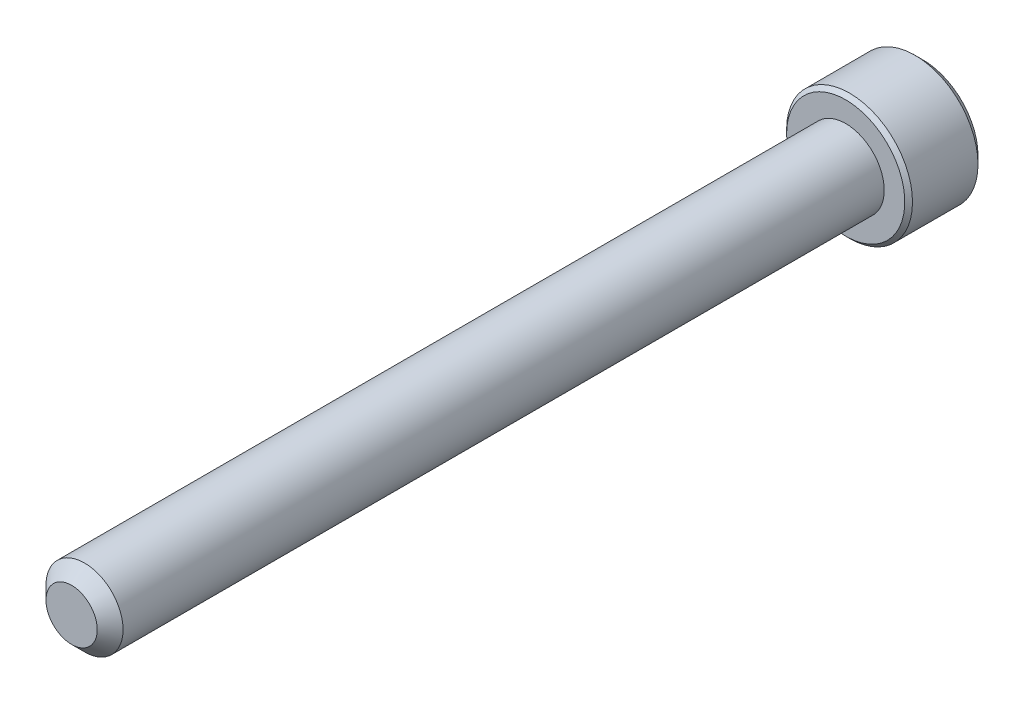
ISO-10303-21;
HEADER;
FILE_DESCRIPTION(('STEP AP214'),'2;1');
FILE_NAME('part.step','',(''),(''),'','','');
FILE_SCHEMA(('AUTOMOTIVE_DESIGN { 1 0 10303 214 1 1 1 1 }'));
ENDSEC;
DATA;
#1=APPLICATION_CONTEXT('core data for automotive mechanical design processes');
#2=APPLICATION_PROTOCOL_DEFINITION('international standard','automotive_design',2000,#1);
#3=PRODUCT_CONTEXT('',#1,'mechanical');
#4=PRODUCT('Part','Part','',(#3));
#5=PRODUCT_RELATED_PRODUCT_CATEGORY('part','',(#4));
#6=PRODUCT_DEFINITION_FORMATION('','',#4);
#7=PRODUCT_DEFINITION_CONTEXT('part definition',#1,'design');
#8=PRODUCT_DEFINITION('design','',#6,#7);
#9=PRODUCT_DEFINITION_SHAPE('','',#8);
#10=(LENGTH_UNIT() NAMED_UNIT(*) SI_UNIT(.MILLI.,.METRE.));
#11=(NAMED_UNIT(*) PLANE_ANGLE_UNIT() SI_UNIT($,.RADIAN.));
#12=(NAMED_UNIT(*) SI_UNIT($,.STERADIAN.) SOLID_ANGLE_UNIT());
#13=UNCERTAINTY_MEASURE_WITH_UNIT(LENGTH_MEASURE(1.E-05),#10,'distance_accuracy_value','');
#14=(GEOMETRIC_REPRESENTATION_CONTEXT(3) GLOBAL_UNCERTAINTY_ASSIGNED_CONTEXT((#13)) GLOBAL_UNIT_ASSIGNED_CONTEXT((#10,
#11,#12)) REPRESENTATION_CONTEXT('',''));
#15=CARTESIAN_POINT('',(0.,0.,0.));
#16=DIRECTION('',(0.,0.,1.));
#17=DIRECTION('',(1.,0.,0.));
#18=AXIS2_PLACEMENT_3D('',#15,#16,#17);
#19=CARTESIAN_POINT('',(0.,-1.3748153285078,-29.6338625));
#20=DIRECTION('',(-0.5,-0.866025403784439,0.));
#21=DIRECTION('',(0.866025403784439,-0.5,0.));
#22=AXIS2_PLACEMENT_3D('',#19,#20,#21);
#23=PLANE('',#22);
#24=CARTESIAN_POINT('',(-1.19062500000947,-0.687407664248433,-31.419799999976));
#25=CARTESIAN_POINT('',(-1.14970263915883,-0.711034200301427,-31.3961961353068));
#26=CARTESIAN_POINT('',(-1.10809605275483,-0.735055774161836,-31.3739787963381));
#27=CARTESIAN_POINT('',(-1.0232559533355,-0.784038228399662,-31.3332997972854));
#28=CARTESIAN_POINT('',(-0.980014376431084,-0.809003764465609,-31.3148607635881));
#29=CARTESIAN_POINT('',(-0.892819863322759,-0.859345540080559,-31.2832745706197));
#30=CARTESIAN_POINT('',(-0.848889120874763,-0.884708966058609,-31.2700480421483));
#31=CARTESIAN_POINT('',(-0.7600607470476,-0.935994051599398,-31.2496700714258));
#32=CARTESIAN_POINT('',(-0.715165827352157,-0.961914145570809,-31.2425034234416));
#33=CARTESIAN_POINT('',(-0.637785345131606,-1.00658978781087,-31.2360368684369));
#34=CARTESIAN_POINT('',(-0.60539964453216,-1.02528768076985,-31.2350799496546));
#35=CARTESIAN_POINT('',(-0.540685248330283,-1.06265055483745,-31.2366947291591));
#36=CARTESIAN_POINT('',(-0.508356566899428,-1.0813155277641,-31.2392672069074));
#37=CARTESIAN_POINT('',(-0.444011322800056,-1.11846527176594,-31.2477920715092));
#38=CARTESIAN_POINT('',(-0.411995078566505,-1.13694985899263,-31.2537476012977));
#39=CARTESIAN_POINT('',(-0.348497138373333,-1.17361041185614,-31.2687178210919));
#40=CARTESIAN_POINT('',(-0.317015677883339,-1.19178624154452,-31.2777338237732));
#41=CARTESIAN_POINT('',(-0.23642342536327,-1.23831620023158,-31.3044792357911));
#42=CARTESIAN_POINT('',(-0.187819783518667,-1.26637752593416,-31.324216001135));
#43=CARTESIAN_POINT('',(-0.0925140443482053,-1.32140232009954,-31.3686731392571));
#44=CARTESIAN_POINT('',(-0.0458063370090463,-1.34836902750503,-31.3933772891883));
#45=CARTESIAN_POINT('',(9.47163938019984E-12,-1.37481532851327,-31.419799999976));
#46=B_SPLINE_CURVE_WITH_KNOTS('',3,(#24,#25,#26,#27,#28,#29,#30,#31,#32,#33,#34,#35,#36,#37,#38,
#39,#40,#41,#42,#43,#44,#45),.UNSPECIFIED.,.F.,.F.,(4,2,2,2,2,2,2,2,2,2,4),(0.,
0.158570945775216,0.318065397813524,0.47502761724658,0.631594801043946,0.743660160731759,
0.855750273857228,0.967944692043723,1.08018729276219,1.25836291040364,1.43596581387528),.UNSPECIFIED.);
#47=CARTESIAN_POINT('',(-1.19062500000866,-0.687407664254367,-31.4197999999783));
#48=VERTEX_POINT('',#47);
#49=CARTESIAN_POINT('',(-3.92425127577737E-12,-1.37481532851553,-31.4197999999783));
#50=VERTEX_POINT('',#49);
#51=EDGE_CURVE('E21',#48,#50,#46,.T.);
#52=ORIENTED_EDGE('',*,*,#51,.F.);
#53=DIRECTION('',(0.,0.,1.));
#54=VECTOR('',#53,1.);
#55=CARTESIAN_POINT('',(-1.190625,-0.6874076642539,-29.6338625));
#56=LINE('',#55,#54);
#57=CARTESIAN_POINT('',(-1.190625,-0.6874076642539,-29.6338625));
#58=VERTEX_POINT('',#57);
#59=EDGE_CURVE('E102',#48,#58,#56,.T.);
#60=ORIENTED_EDGE('',*,*,#59,.T.);
#61=DIRECTION('',(0.866025403784439,-0.5,0.));
#62=VECTOR('',#61,1.);
#63=CARTESIAN_POINT('',(0.,-1.3748153285078,-29.6338625));
#64=LINE('',#63,#62);
#65=CARTESIAN_POINT('',(0.,-1.3748153285078,-29.6338625));
#66=VERTEX_POINT('',#65);
#67=EDGE_CURVE('E75',#66,#58,#64,.F.);
#68=ORIENTED_EDGE('',*,*,#67,.F.);
#69=DIRECTION('',(0.,0.,1.));
#70=VECTOR('',#69,1.);
#71=CARTESIAN_POINT('',(0.,-1.3748153285078,-29.6338625));
#72=LINE('',#71,#70);
#73=EDGE_CURVE('E74',#66,#50,#72,.F.);
#74=ORIENTED_EDGE('',*,*,#73,.T.);
#75=EDGE_LOOP('',(#52,#60,#68,#74));
#76=FACE_BOUND('',#75,.T.);
#77=ADVANCED_FACE('F17',(#76),#23,.F.);
#78=CARTESIAN_POINT('',(1.190625,-0.687407664253899,-29.6338625));
#79=DIRECTION('',(0.500000000000001,-0.866025403784438,0.));
#80=DIRECTION('',(0.866025403784438,0.500000000000001,0.));
#81=AXIS2_PLACEMENT_3D('',#78,#79,#80);
#82=PLANE('',#81);
#83=CARTESIAN_POINT('',(-9.46668614972061E-12,-1.37481532851326,-31.419799999976));
#84=CARTESIAN_POINT('',(0.0409223608411768,-1.35118879246027,-31.3961961353068));
#85=CARTESIAN_POINT('',(0.0825289472451737,-1.32716721859986,-31.3739787963381));
#86=CARTESIAN_POINT('',(0.167369046664505,-1.27818476436203,-31.3332997972854));
#87=CARTESIAN_POINT('',(0.210610623568917,-1.25321922829609,-31.3148607635881));
#88=CARTESIAN_POINT('',(0.297805136677241,-1.20287745268114,-31.2832745706197));
#89=CARTESIAN_POINT('',(0.341735879125237,-1.17751402670309,-31.2700480421483));
#90=CARTESIAN_POINT('',(0.430564252952399,-1.1262289411623,-31.2496700714258));
#91=CARTESIAN_POINT('',(0.475459172647842,-1.10030884719089,-31.2425034234416));
#92=CARTESIAN_POINT('',(0.552839654868392,-1.05563320495083,-31.2360368684369));
#93=CARTESIAN_POINT('',(0.585225355467838,-1.03693531199185,-31.2350799496546));
#94=CARTESIAN_POINT('',(0.649939751669716,-0.999572437924248,-31.2366947291591));
#95=CARTESIAN_POINT('',(0.682268433100571,-0.980907464997598,-31.2392672069074));
#96=CARTESIAN_POINT('',(0.746613677199941,-0.943757720995754,-31.2477920715092));
#97=CARTESIAN_POINT('',(0.778629921433492,-0.925273133769073,-31.2537476012977));
#98=CARTESIAN_POINT('',(0.842127861626664,-0.888612580905558,-31.2687178210919));
#99=CARTESIAN_POINT('',(0.873609322116658,-0.870436751217177,-31.2777338237732));
#100=CARTESIAN_POINT('',(0.954201574636729,-0.823906792530116,-31.3044792357911));
#101=CARTESIAN_POINT('',(1.00280521648133,-0.795845466827539,-31.324216001135));
#102=CARTESIAN_POINT('',(1.09811095565179,-0.740820672662157,-31.3686731392571));
#103=CARTESIAN_POINT('',(1.14481866299095,-0.713853965256664,-31.3933772891883));
#104=CARTESIAN_POINT('',(1.19062500000947,-0.687407664248431,-31.419799999976));
#105=B_SPLINE_CURVE_WITH_KNOTS('',3,(#83,#84,#85,#86,#87,#88,#89,#90,#91,#92,#93,#94,#95,#96,
#97,#98,#99,#100,#101,#102,#103,#104),.UNSPECIFIED.,.F.,.F.,(4,2,2,2,2,2,2,2,2,2,4),(0.,
0.158570945775214,0.318065397813521,0.475027617246576,0.631594801043941,0.743660160731754,
0.855750273857224,0.967944692043717,1.08018729276218,1.25836291040363,1.43596581387527),.UNSPECIFIED.);
#106=CARTESIAN_POINT('',(1.19062500000473,-0.687407664261168,-31.4197999999783));
#107=VERTEX_POINT('',#106);
#108=EDGE_CURVE('E82',#50,#107,#105,.T.);
#109=ORIENTED_EDGE('',*,*,#108,.F.);
#110=ORIENTED_EDGE('',*,*,#73,.F.);
#111=DIRECTION('',(-0.866025403784438,-0.500000000000001,0.));
#112=VECTOR('',#111,1.);
#113=CARTESIAN_POINT('',(1.190625,-0.687407664253899,-29.6338625));
#114=LINE('',#113,#112);
#115=CARTESIAN_POINT('',(1.190625,-0.687407664253899,-29.6338625));
#116=VERTEX_POINT('',#115);
#117=EDGE_CURVE('E262',#116,#66,#114,.T.);
#118=ORIENTED_EDGE('',*,*,#117,.F.);
#119=DIRECTION('',(0.,0.,-1.));
#120=VECTOR('',#119,1.);
#121=CARTESIAN_POINT('',(1.190625,-0.687407664253899,-29.6338625));
#122=LINE('',#121,#120);
#123=EDGE_CURVE('E101',#116,#107,#122,.T.);
#124=ORIENTED_EDGE('',*,*,#123,.T.);
#125=EDGE_LOOP('',(#109,#110,#118,#124));
#126=FACE_BOUND('',#125,.T.);
#127=ADVANCED_FACE('F99',(#126),#82,.F.);
#128=CARTESIAN_POINT('',(-1.190625,-0.6874076642539,-29.6338625));
#129=DIRECTION('',(-1.,0.,0.));
#130=DIRECTION('',(0.,0.,1.));
#131=AXIS2_PLACEMENT_3D('',#128,#129,#130);
#132=PLANE('',#131);
#133=CARTESIAN_POINT('',(-1.190625,0.687407664264832,-31.419799999976));
#134=CARTESIAN_POINT('',(-1.190625,0.64046328206383,-31.3963497101777));
#135=CARTESIAN_POINT('',(-1.190625,0.592738991388359,-31.3742686861103));
#136=CARTESIAN_POINT('',(-1.190625,0.495406225244424,-31.333793723002));
#137=CARTESIAN_POINT('',(-1.190625,0.445787629552447,-31.3154243363641));
#138=CARTESIAN_POINT('',(-1.190625,0.34511637578351,-31.2837043536914));
#139=CARTESIAN_POINT('',(-1.190625,0.294069215527516,-31.2703367724748));
#140=CARTESIAN_POINT('',(-1.190625,0.190855854749368,-31.2497568033153));
#141=CARTESIAN_POINT('',(-1.190625,0.138693633064173,-31.2425253813538));
#142=CARTESIAN_POINT('',(-1.190625,0.0719511129773052,-31.237694661557));
#143=CARTESIAN_POINT('',(-1.190625,0.0575681066393699,-31.2369136853177));
#144=CARTESIAN_POINT('',(-1.190625,0.0287907386930202,-31.2358710957495));
#145=CARTESIAN_POINT('',(-1.190625,0.0143963875095152,-31.2356092002874));
#146=CARTESIAN_POINT('',(-1.190625,-0.0361321030415022,-31.2356108540204));
#147=CARTESIAN_POINT('',(-1.190625,-0.0722770331313775,-31.2372647137692));
#148=CARTESIAN_POINT('',(-1.190625,-0.144284982569758,-31.2437819307184));
#149=CARTESIAN_POINT('',(-1.190625,-0.180147787625379,-31.2486475264665));
#150=CARTESIAN_POINT('',(-1.190625,-0.287258251635282,-31.2677577376471));
#151=CARTESIAN_POINT('',(-1.190625,-0.357725297303739,-31.2865125356331));
#152=CARTESIAN_POINT('',(-1.190625,-0.471552892406714,-31.3248800215181));
#153=CARTESIAN_POINT('',(-1.190625,-0.515840765873892,-31.3419407465822));
#154=CARTESIAN_POINT('',(-1.190625,-0.602739573091705,-31.3789168423901));
#155=CARTESIAN_POINT('',(-1.190625,-0.6453621399291,-31.3988046757956));
#156=CARTESIAN_POINT('',(-1.190625,-0.687407664264836,-31.419799999976));
#157=B_SPLINE_CURVE_WITH_KNOTS('',3,(#133,#134,#135,#136,#137,#138,#139,#140,#141,#142,#143,
#144,#145,#146,#147,#148,#149,#150,#151,#152,#153,#154,#155,#156),.UNSPECIFIED.,.F.,.F.,(4,2,2,
2,2,2,2,2,2,2,2,4),(0.,0.157535403104346,0.316081041462619,0.474083294584059,0.631593623092558,
0.674799715056989,0.717982317001116,0.826362160348214,0.934817623227524,1.15262451047766,
1.29491478052885,1.43590359048538),.UNSPECIFIED.);
#158=CARTESIAN_POINT('',(-1.19062500000474,0.687407664261165,-31.4197999999783));
#159=VERTEX_POINT('',#158);
#160=EDGE_CURVE('E59',#159,#48,#157,.T.);
#161=ORIENTED_EDGE('',*,*,#160,.F.);
#162=DIRECTION('',(0.,0.,1.));
#163=VECTOR('',#162,1.);
#164=CARTESIAN_POINT('',(-1.190625,0.687407664253897,-29.6338625));
#165=LINE('',#164,#163);
#166=CARTESIAN_POINT('',(-1.190625,0.687407664253897,-29.6338625));
#167=VERTEX_POINT('',#166);
#168=EDGE_CURVE('E239',#159,#167,#165,.T.);
#169=ORIENTED_EDGE('',*,*,#168,.T.);
#170=DIRECTION('',(0.,1.,0.));
#171=VECTOR('',#170,1.);
#172=CARTESIAN_POINT('',(-1.190625,2.06222299276169,-29.6338625));
#173=LINE('',#172,#171);
#174=EDGE_CURVE('E258',#58,#167,#173,.T.);
#175=ORIENTED_EDGE('',*,*,#174,.F.);
#176=ORIENTED_EDGE('',*,*,#59,.F.);
#177=EDGE_LOOP('',(#161,#169,#175,#176));
#178=FACE_BOUND('',#177,.T.);
#179=ADVANCED_FACE('F118',(#178),#132,.F.);
#180=CARTESIAN_POINT('',(1.190625,2.06222299276169,-29.6338625));
#181=DIRECTION('',(0.,0.,-1.));
#182=DIRECTION('',(-1.,0.,0.));
#183=AXIS2_PLACEMENT_3D('',#180,#181,#182);
#184=PLANE('',#183);
#185=ORIENTED_EDGE('',*,*,#67,.T.);
#186=ORIENTED_EDGE('',*,*,#174,.T.);
#187=DIRECTION('',(-0.866025403784439,-0.5,0.));
#188=VECTOR('',#187,1.);
#189=CARTESIAN_POINT('',(-1.190625,0.687407664253897,-29.6338625));
#190=LINE('',#189,#188);
#191=CARTESIAN_POINT('',(0.,1.3748153285078,-29.6338625));
#192=VERTEX_POINT('',#191);
#193=EDGE_CURVE('E139',#167,#192,#190,.F.);
#194=ORIENTED_EDGE('',*,*,#193,.T.);
#195=DIRECTION('',(-0.866025403784439,0.5,0.));
#196=VECTOR('',#195,1.);
#197=CARTESIAN_POINT('',(0.,1.3748153285078,-29.6338625));
#198=LINE('',#197,#196);
#199=CARTESIAN_POINT('',(1.190625,0.687407664253899,-29.6338625));
#200=VERTEX_POINT('',#199);
#201=EDGE_CURVE('E236',#192,#200,#198,.F.);
#202=ORIENTED_EDGE('',*,*,#201,.T.);
#203=DIRECTION('',(0.,1.,0.));
#204=VECTOR('',#203,1.);
#205=CARTESIAN_POINT('',(1.190625,0.687407664253899,-29.6338625));
#206=LINE('',#205,#204);
#207=EDGE_CURVE('E253',#200,#116,#206,.F.);
#208=ORIENTED_EDGE('',*,*,#207,.T.);
#209=ORIENTED_EDGE('',*,*,#117,.T.);
#210=EDGE_LOOP('',(#185,#186,#194,#202,#208,#209));
#211=FACE_BOUND('',#210,.T.);
#212=ADVANCED_FACE('F122',(#211),#184,.T.);
#213=CARTESIAN_POINT('',(1.190625,0.687407664253899,-29.6338625));
#214=DIRECTION('',(1.,0.,0.));
#215=DIRECTION('',(0.,0.,-1.));
#216=AXIS2_PLACEMENT_3D('',#213,#214,#215);
#217=PLANE('',#216);
#218=CARTESIAN_POINT('',(1.190625,-0.687407664264835,-31.419799999976));
#219=CARTESIAN_POINT('',(1.190625,-0.640154592158846,-31.3961961353068));
#220=CARTESIAN_POINT('',(1.190625,-0.592111444438028,-31.3739787963381));
#221=CARTESIAN_POINT('',(1.190625,-0.494146535962377,-31.3332997972854));
#222=CARTESIAN_POINT('',(1.190625,-0.444215463830485,-31.3148607635881));
#223=CARTESIAN_POINT('',(1.190625,-0.343531912600586,-31.2832745706197));
#224=CARTESIAN_POINT('',(1.190625,-0.292805060644485,-31.2700480421483));
#225=CARTESIAN_POINT('',(1.190625,-0.190234889562905,-31.2496700714258));
#226=CARTESIAN_POINT('',(1.190625,-0.138394701620084,-31.2425034234416));
#227=CARTESIAN_POINT('',(1.190625,-0.0490434171399681,-31.2360368684369));
#228=CARTESIAN_POINT('',(1.190625,-0.0116476312219986,-31.2350799496546));
#229=CARTESIAN_POINT('',(1.190625,0.0630781169131979,-31.2366947291591));
#230=CARTESIAN_POINT('',(1.190625,0.100408062766497,-31.2392672069074));
#231=CARTESIAN_POINT('',(1.190625,0.174707550770185,-31.2477920715092));
#232=CARTESIAN_POINT('',(1.190625,0.211676725223548,-31.2537476012976));
#233=CARTESIAN_POINT('',(1.190625,0.284997830950577,-31.2687178210919));
#234=CARTESIAN_POINT('',(1.190625,0.321349490327338,-31.2777338237732));
#235=CARTESIAN_POINT('',(1.190625,0.414409407701385,-31.3044792357911));
#236=CARTESIAN_POINT('',(1.190625,0.470532059106468,-31.324216001135));
#237=CARTESIAN_POINT('',(1.190625,0.580581647437094,-31.368673139257));
#238=CARTESIAN_POINT('',(1.190625,0.634515062248015,-31.3933772891881));
#239=CARTESIAN_POINT('',(1.190625,0.687407664264415,-31.4197999999758));
#240=B_SPLINE_CURVE_WITH_KNOTS('',3,(#218,#219,#220,#221,#222,#223,#224,#225,#226,#227,#228,
#229,#230,#231,#232,#233,#234,#235,#236,#237,#238,#239),.UNSPECIFIED.,.F.,.F.,(4,2,2,2,2,2,2,2,
2,2,4),(0.,0.158570945775211,0.318065397813519,0.475027617246574,0.631594801043942,
0.743660160731755,0.855750273857225,0.967944692043717,1.08018729276218,1.2583629104034,
1.43596581387481),.UNSPECIFIED.);
#241=CARTESIAN_POINT('',(1.19062500000455,0.687407664256528,-31.4197999999758));
#242=VERTEX_POINT('',#241);
#243=EDGE_CURVE('E39',#107,#242,#240,.T.);
#244=ORIENTED_EDGE('',*,*,#243,.F.);
#245=ORIENTED_EDGE('',*,*,#123,.F.);
#246=ORIENTED_EDGE('',*,*,#207,.F.);
#247=DIRECTION('',(0.,0.,1.));
#248=VECTOR('',#247,1.);
#249=CARTESIAN_POINT('',(1.190625,0.687407664253899,-29.6338625));
#250=LINE('',#249,#248);
#251=EDGE_CURVE('E232',#200,#242,#250,.F.);
#252=ORIENTED_EDGE('',*,*,#251,.T.);
#253=EDGE_LOOP('',(#244,#245,#246,#252));
#254=FACE_BOUND('',#253,.T.);
#255=ADVANCED_FACE('F126',(#254),#217,.F.);
#256=CARTESIAN_POINT('',(-1.190625,0.687407664253897,-29.6338625));
#257=DIRECTION('',(-0.5,0.866025403784439,0.));
#258=DIRECTION('',(-0.866025403784439,-0.5,0.));
#259=AXIS2_PLACEMENT_3D('',#256,#257,#258);
#260=PLANE('',#259);
#261=CARTESIAN_POINT('',(9.10799777766905E-12,1.37481532851305,-31.4197999999758));
#262=CARTESIAN_POINT('',(-0.0409223608415128,1.35118879246007,-31.3961961353066));
#263=CARTESIAN_POINT('',(-0.0825289472454881,1.32716721859968,-31.3739787963379));
#264=CARTESIAN_POINT('',(-0.167369046664774,1.27818476436188,-31.3332997972853));
#265=CARTESIAN_POINT('',(-0.210610623569161,1.25321922829594,-31.314860763588));
#266=CARTESIAN_POINT('',(-0.297805136677435,1.20287745268102,-31.2832745706197));
#267=CARTESIAN_POINT('',(-0.341735879125405,1.17751402670299,-31.2700480421483));
#268=CARTESIAN_POINT('',(-0.430564252952515,1.12622894116223,-31.2496700714258));
#269=CARTESIAN_POINT('',(-0.475459172647931,1.10030884719084,-31.2425034234415));
#270=CARTESIAN_POINT('',(-0.552839654868453,1.05563320495079,-31.2360368684369));
#271=CARTESIAN_POINT('',(-0.585225355467897,1.03693531199181,-31.2350799496546));
#272=CARTESIAN_POINT('',(-0.649939751669772,0.999572437924213,-31.2366947291591));
#273=CARTESIAN_POINT('',(-0.682268433100626,0.980907464997565,-31.2392672069074));
#274=CARTESIAN_POINT('',(-0.746613677199994,0.943757720995722,-31.2477920715092));
#275=CARTESIAN_POINT('',(-0.778629921433543,0.925273133769042,-31.2537476012977));
#276=CARTESIAN_POINT('',(-0.842127861626712,0.888612580905529,-31.2687178210919));
#277=CARTESIAN_POINT('',(-0.873609322116705,0.870436751217149,-31.2777338237732));
#278=CARTESIAN_POINT('',(-0.954201574636767,0.823906792530093,-31.3044792357911));
#279=CARTESIAN_POINT('',(-1.00280521648136,0.795845466827519,-31.324216001135));
#280=CARTESIAN_POINT('',(-1.09811095565181,0.740820672662145,-31.3686731392571));
#281=CARTESIAN_POINT('',(-1.14481866299096,0.713853965256656,-31.3933772891883));
#282=CARTESIAN_POINT('',(-1.19062500000947,0.687407664248429,-31.419799999976));
#283=B_SPLINE_CURVE_WITH_KNOTS('',3,(#261,#262,#263,#264,#265,#266,#267,#268,#269,#270,#271,
#272,#273,#274,#275,#276,#277,#278,#279,#280,#281,#282),.UNSPECIFIED.,.F.,.F.,(4,2,2,2,2,2,2,2,
2,2,4),(0.,0.158570945775115,0.318065397813318,0.475027617246276,0.631594801043547,
0.743660160731355,0.85575027385682,0.967944692043309,1.08018729276177,1.2583629104032,
1.43596581387481),.UNSPECIFIED.);
#284=CARTESIAN_POINT('',(-4.1079627173878E-12,1.37481532851543,-31.4197999999782));
#285=VERTEX_POINT('',#284);
#286=EDGE_CURVE('E140',#285,#159,#283,.T.);
#287=ORIENTED_EDGE('',*,*,#286,.F.);
#288=DIRECTION('',(0.,0.,1.));
#289=VECTOR('',#288,1.);
#290=CARTESIAN_POINT('',(0.,1.3748153285078,-29.6338625));
#291=LINE('',#290,#289);
#292=EDGE_CURVE('E163',#285,#192,#291,.T.);
#293=ORIENTED_EDGE('',*,*,#292,.T.);
#294=ORIENTED_EDGE('',*,*,#193,.F.);
#295=ORIENTED_EDGE('',*,*,#168,.F.);
#296=EDGE_LOOP('',(#287,#293,#294,#295));
#297=FACE_BOUND('',#296,.T.);
#298=ADVANCED_FACE('F131',(#297),#260,.F.);
#299=CARTESIAN_POINT('',(0.,1.3748153285078,-29.6338625));
#300=DIRECTION('',(0.5,0.866025403784439,0.));
#301=DIRECTION('',(-0.866025403784439,0.5,0.));
#302=AXIS2_PLACEMENT_3D('',#299,#300,#301);
#303=PLANE('',#302);
#304=CARTESIAN_POINT('',(-1.02308883374592E-11,1.37481532850951,-31.4197999999774));
#305=CARTESIAN_POINT('',(0.0409223608410308,1.35118879245884,-31.3961961353073));
#306=CARTESIAN_POINT('',(0.0825289472452016,1.32716721859944,-31.3739787963382));
#307=CARTESIAN_POINT('',(0.167369046664461,1.27818476436247,-31.3332997972853));
#308=CARTESIAN_POINT('',(0.210610623568624,1.25321922829636,-31.3148607635882));
#309=CARTESIAN_POINT('',(0.297805136676534,1.20287745268144,-31.28327457062));
#310=CARTESIAN_POINT('',(0.341735879124362,1.17751402670356,-31.2700480421486));
#311=CARTESIAN_POINT('',(0.430564252951166,1.12622894116304,-31.2496700714261));
#312=CARTESIAN_POINT('',(0.475459172646418,1.10030884719172,-31.2425034234417));
#313=CARTESIAN_POINT('',(0.552839654866734,1.05563320495178,-31.236036868437));
#314=CARTESIAN_POINT('',(0.585225355466133,1.03693531199283,-31.2350799496546));
#315=CARTESIAN_POINT('',(0.649939751667922,0.999572437925284,-31.236694729159));
#316=CARTESIAN_POINT('',(0.682268433098733,0.980907464998659,-31.2392672069073));
#317=CARTESIAN_POINT('',(0.74661367719803,0.943757720996857,-31.2477920715089));
#318=CARTESIAN_POINT('',(0.77862992143155,0.925273133770193,-31.2537476012973));
#319=CARTESIAN_POINT('',(0.842127861624665,0.888612580906712,-31.2687178210914));
#320=CARTESIAN_POINT('',(0.873609322114632,0.870436751218347,-31.2777338237726));
#321=CARTESIAN_POINT('',(0.954201574634937,0.82390679253115,-31.3044792357904));
#322=CARTESIAN_POINT('',(1.00280521647979,0.795845466828426,-31.3242160011344));
#323=CARTESIAN_POINT('',(1.09811095565073,0.740820672662768,-31.3686731392566));
#324=CARTESIAN_POINT('',(1.14481866299012,0.713853965257145,-31.3933772891879));
#325=CARTESIAN_POINT('',(1.19062500000885,0.687407664248789,-31.4197999999757));
#326=B_SPLINE_CURVE_WITH_KNOTS('',3,(#304,#305,#306,#307,#308,#309,#310,#311,#312,#313,#314,
#315,#316,#317,#318,#319,#320,#321,#322,#323,#324,#325),.UNSPECIFIED.,.F.,.F.,(4,2,2,2,2,2,2,2,
2,2,4),(0.,0.158570945774693,0.318065397812396,0.475027617244803,0.631594801041557,
0.743660160729211,0.855750273854519,0.967944692040871,1.08018729275919,1.2583629104015,
1.43596581387395),.UNSPECIFIED.);
#327=EDGE_CURVE('E156',#285,#242,#326,.T.);
#328=ORIENTED_EDGE('',*,*,#327,.T.);
#329=ORIENTED_EDGE('',*,*,#251,.F.);
#330=ORIENTED_EDGE('',*,*,#201,.F.);
#331=ORIENTED_EDGE('',*,*,#292,.F.);
#332=EDGE_LOOP('',(#328,#329,#330,#331));
#333=FACE_BOUND('',#332,.T.);
#334=ADVANCED_FACE('F165',(#333),#303,.F.);
#335=CARTESIAN_POINT('',(0.,0.,-31.4197999999237));
#336=DIRECTION('',(0.,0.,-1.));
#337=DIRECTION('',(-1.,0.,0.));
#338=AXIS2_PLACEMENT_3D('',#335,#336,#337);
#339=CONICAL_SURFACE('',#338,1.37481532846095,0.785398163397448);
#340=ORIENTED_EDGE('',*,*,#286,.T.);
#341=CARTESIAN_POINT('',(0.,0.,-31.4197999999806));
#342=DIRECTION('',(0.,0.,-1.));
#343=DIRECTION('',(-1.,0.,0.));
#344=AXIS2_PLACEMENT_3D('',#341,#342,#343);
#345=CIRCLE('',#344,1.3748153285178);
#346=EDGE_CURVE('E162',#285,#159,#345,.F.);
#347=ORIENTED_EDGE('',*,*,#346,.F.);
#348=EDGE_LOOP('',(#340,#347));
#349=FACE_BOUND('',#348,.T.);
#350=ADVANCED_FACE('F168',(#349),#339,.F.);
#351=CARTESIAN_POINT('',(0.,0.,-31.4197999999237));
#352=DIRECTION('',(0.,0.,-1.));
#353=DIRECTION('',(-1.,0.,0.));
#354=AXIS2_PLACEMENT_3D('',#351,#352,#353);
#355=CONICAL_SURFACE('',#354,1.37481532846095,0.785398163397448);
#356=ORIENTED_EDGE('',*,*,#160,.T.);
#357=CARTESIAN_POINT('',(0.,0.,-31.4197999999806));
#358=DIRECTION('',(0.,0.,-1.));
#359=DIRECTION('',(-1.,0.,0.));
#360=AXIS2_PLACEMENT_3D('',#357,#358,#359);
#361=CIRCLE('',#360,1.3748153285178);
#362=EDGE_CURVE('E92',#159,#48,#361,.F.);
#363=ORIENTED_EDGE('',*,*,#362,.F.);
#364=EDGE_LOOP('',(#356,#363));
#365=FACE_BOUND('',#364,.T.);
#366=ADVANCED_FACE('F172',(#365),#355,.F.);
#367=CARTESIAN_POINT('',(0.,0.,-31.4197999999237));
#368=DIRECTION('',(0.,0.,-1.));
#369=DIRECTION('',(-1.,0.,0.));
#370=AXIS2_PLACEMENT_3D('',#367,#368,#369);
#371=CONICAL_SURFACE('',#370,1.37481532846095,0.785398163397448);
#372=ORIENTED_EDGE('',*,*,#51,.T.);
#373=CARTESIAN_POINT('',(0.,0.,-31.4197999999806));
#374=DIRECTION('',(0.,0.,-1.));
#375=DIRECTION('',(-1.,0.,0.));
#376=AXIS2_PLACEMENT_3D('',#373,#374,#375);
#377=CIRCLE('',#376,1.3748153285178);
#378=EDGE_CURVE('E70',#48,#50,#377,.F.);
#379=ORIENTED_EDGE('',*,*,#378,.F.);
#380=EDGE_LOOP('',(#372,#379));
#381=FACE_BOUND('',#380,.T.);
#382=ADVANCED_FACE('F68',(#381),#371,.F.);
#383=CARTESIAN_POINT('',(0.,0.,-31.4197999999237));
#384=DIRECTION('',(0.,0.,-1.));
#385=DIRECTION('',(-1.,0.,0.));
#386=AXIS2_PLACEMENT_3D('',#383,#384,#385);
#387=CONICAL_SURFACE('',#386,1.37481532846095,0.785398163397448);
#388=ORIENTED_EDGE('',*,*,#108,.T.);
#389=CARTESIAN_POINT('',(0.,0.,-31.4197999999806));
#390=DIRECTION('',(0.,0.,-1.));
#391=DIRECTION('',(-1.,0.,0.));
#392=AXIS2_PLACEMENT_3D('',#389,#390,#391);
#393=CIRCLE('',#392,1.3748153285178);
#394=EDGE_CURVE('E90',#50,#107,#393,.F.);
#395=ORIENTED_EDGE('',*,*,#394,.F.);
#396=EDGE_LOOP('',(#388,#395));
#397=FACE_BOUND('',#396,.T.);
#398=ADVANCED_FACE('F95',(#397),#387,.F.);
#399=CARTESIAN_POINT('',(0.,0.,-31.4197999999237));
#400=DIRECTION('',(0.,0.,-1.));
#401=DIRECTION('',(-1.,0.,0.));
#402=AXIS2_PLACEMENT_3D('',#399,#400,#401);
#403=CONICAL_SURFACE('',#402,1.37481532846095,0.785398163397448);
#404=ORIENTED_EDGE('',*,*,#243,.T.);
#405=CARTESIAN_POINT('',(0.,0.,-31.4197999999806));
#406=DIRECTION('',(0.,0.,-1.));
#407=DIRECTION('',(-1.,0.,0.));
#408=AXIS2_PLACEMENT_3D('',#405,#406,#407);
#409=CIRCLE('',#408,1.3748153285178);
#410=EDGE_CURVE('E97',#107,#242,#409,.F.);
#411=ORIENTED_EDGE('',*,*,#410,.F.);
#412=EDGE_LOOP('',(#404,#411));
#413=FACE_BOUND('',#412,.T.);
#414=ADVANCED_FACE('F146',(#413),#403,.F.);
#415=CARTESIAN_POINT('',(0.,0.,-31.4197999999237));
#416=DIRECTION('',(0.,0.,-1.));
#417=DIRECTION('',(-1.,0.,0.));
#418=AXIS2_PLACEMENT_3D('',#415,#416,#417);
#419=CONICAL_SURFACE('',#418,1.37481532846095,0.785398163397448);
#420=ORIENTED_EDGE('',*,*,#327,.F.);
#421=CARTESIAN_POINT('',(0.,0.,-31.4197999999806));
#422=DIRECTION('',(0.,0.,-1.));
#423=DIRECTION('',(-1.,0.,0.));
#424=AXIS2_PLACEMENT_3D('',#421,#422,#423);
#425=CIRCLE('',#424,1.3748153285178);
#426=EDGE_CURVE('E227',#242,#285,#425,.F.);
#427=ORIENTED_EDGE('',*,*,#426,.F.);
#428=EDGE_LOOP('',(#420,#427));
#429=FACE_BOUND('',#428,.T.);
#430=ADVANCED_FACE('F150',(#429),#419,.F.);
#431=CARTESIAN_POINT('',(0.,0.,-31.4198));
#432=DIRECTION('',(0.,0.,-1.));
#433=DIRECTION('',(-1.,0.,0.));
#434=AXIS2_PLACEMENT_3D('',#431,#432,#433);
#435=PLANE('',#434);
#436=ORIENTED_EDGE('',*,*,#410,.T.);
#437=ORIENTED_EDGE('',*,*,#426,.T.);
#438=ORIENTED_EDGE('',*,*,#346,.T.);
#439=ORIENTED_EDGE('',*,*,#362,.T.);
#440=ORIENTED_EDGE('',*,*,#378,.T.);
#441=ORIENTED_EDGE('',*,*,#394,.T.);
#442=EDGE_LOOP('',(#436,#437,#438,#439,#440,#441));
#443=FACE_BOUND('',#442,.T.);
#444=CARTESIAN_POINT('',(0.,0.,-31.4197999999806));
#445=DIRECTION('',(0.,0.,1.));
#446=DIRECTION('',(1.,0.,0.));
#447=AXIS2_PLACEMENT_3D('',#444,#445,#446);
#448=CIRCLE('',#447,2.03962000000502);
#449=CARTESIAN_POINT('',(2.03962000000502,0.,-31.4197999999806));
#450=VERTEX_POINT('',#449);
#451=EDGE_CURVE('E218',#450,#450,#448,.T.);
#452=ORIENTED_EDGE('',*,*,#451,.F.);
#453=EDGE_LOOP('',(#452));
#454=FACE_BOUND('',#453,.T.);
#455=ADVANCED_FACE('F88',(#443,#454),#435,.T.);
#456=CARTESIAN_POINT('',(0.,0.,-31.1353200000326));
#457=DIRECTION('',(0.,0.,1.));
#458=DIRECTION('',(1.,0.,0.));
#459=AXIS2_PLACEMENT_3D('',#456,#457,#458);
#460=CONICAL_SURFACE('',#459,2.32409999989613,0.785398163297541);
#461=ORIENTED_EDGE('',*,*,#451,.T.);
#462=EDGE_LOOP('',(#461));
#463=FACE_BOUND('',#462,.T.);
#464=CARTESIAN_POINT('',(0.,0.,-31.13532));
#465=DIRECTION('',(0.,0.,1.));
#466=DIRECTION('',(1.,0.,0.));
#467=AXIS2_PLACEMENT_3D('',#464,#465,#466);
#468=CIRCLE('',#467,2.3241);
#469=CARTESIAN_POINT('',(2.3241,0.,-31.13532));
#470=VERTEX_POINT('',#469);
#471=EDGE_CURVE('E221',#470,#470,#468,.T.);
#472=ORIENTED_EDGE('',*,*,#471,.F.);
#473=EDGE_LOOP('',(#472));
#474=FACE_BOUND('',#473,.T.);
#475=ADVANCED_FACE('F208',(#463,#474),#460,.T.);
#476=CARTESIAN_POINT('',(0.,0.,-31.4198));
#477=DIRECTION('',(0.,0.,1.));
#478=DIRECTION('',(1.,0.,0.));
#479=AXIS2_PLACEMENT_3D('',#476,#477,#478);
#480=CYLINDRICAL_SURFACE('',#479,2.3241);
#481=ORIENTED_EDGE('',*,*,#471,.T.);
#482=EDGE_LOOP('',(#481));
#483=FACE_BOUND('',#482,.T.);
#484=CARTESIAN_POINT('',(0.,0.,-28.7172399999918));
#485=DIRECTION('',(0.,0.,-1.));
#486=DIRECTION('',(-1.,0.,0.));
#487=AXIS2_PLACEMENT_3D('',#484,#485,#486);
#488=CIRCLE('',#487,2.32410000000982);
#489=CARTESIAN_POINT('',(-2.32410000000982,0.,-28.7172399999918));
#490=VERTEX_POINT('',#489);
#491=EDGE_CURVE('E222',#490,#490,#488,.F.);
#492=ORIENTED_EDGE('',*,*,#491,.F.);
#493=EDGE_LOOP('',(#492));
#494=FACE_BOUND('',#493,.T.);
#495=ADVANCED_FACE('F205',(#483,#494),#480,.T.);
#496=CARTESIAN_POINT('',(0.,0.,-28.7172399998212));
#497=DIRECTION('',(0.,0.,-1.));
#498=DIRECTION('',(-1.,0.,0.));
#499=AXIS2_PLACEMENT_3D('',#496,#497,#498);
#500=CONICAL_SURFACE('',#499,2.32409999983929,0.785398163597263);
#501=CARTESIAN_POINT('',(0.,0.,-28.5750000000462));
#502=DIRECTION('',(0.,0.,-1.));
#503=DIRECTION('',(-1.,0.,0.));
#504=AXIS2_PLACEMENT_3D('',#501,#502,#503);
#505=CIRCLE('',#504,2.18186000000742);
#506=CARTESIAN_POINT('',(-2.18186000000742,0.,-28.5750000000462));
#507=VERTEX_POINT('',#506);
#508=EDGE_CURVE('E225',#507,#507,#505,.T.);
#509=ORIENTED_EDGE('',*,*,#508,.T.);
#510=EDGE_LOOP('',(#509));
#511=FACE_BOUND('',#510,.T.);
#512=ORIENTED_EDGE('',*,*,#491,.T.);
#513=EDGE_LOOP('',(#512));
#514=FACE_BOUND('',#513,.T.);
#515=ADVANCED_FACE('F201',(#511,#514),#500,.T.);
#516=CARTESIAN_POINT('',(0.,0.,0.));
#517=DIRECTION('',(0.,0.,1.));
#518=DIRECTION('',(1.,0.,0.));
#519=AXIS2_PLACEMENT_3D('',#516,#517,#518);
#520=PLANE('',#519);
#521=CARTESIAN_POINT('',(0.,0.,0.));
#522=DIRECTION('',(0.,0.,-1.));
#523=DIRECTION('',(0.,1.,0.));
#524=AXIS2_PLACEMENT_3D('',#521,#522,#523);
#525=CIRCLE('',#524,0.946149999947466);
#526=CARTESIAN_POINT('',(0.,0.946149999947466,0.));
#527=VERTEX_POINT('',#526);
#528=EDGE_CURVE('E279',#527,#527,#525,.T.);
#529=ORIENTED_EDGE('',*,*,#528,.F.);
#530=EDGE_LOOP('',(#529));
#531=FACE_BOUND('',#530,.T.);
#532=ADVANCED_FACE('F197',(#531),#520,.T.);
#533=CARTESIAN_POINT('',(0.,0.,-28.575));
#534=DIRECTION('',(0.,0.,-1.));
#535=DIRECTION('',(-1.,0.,0.));
#536=AXIS2_PLACEMENT_3D('',#533,#534,#535);
#537=PLANE('',#536);
#538=CARTESIAN_POINT('',(0.,0.,-28.575));
#539=DIRECTION('',(0.,0.,1.));
#540=DIRECTION('',(1.,0.,0.));
#541=AXIS2_PLACEMENT_3D('',#538,#539,#540);
#542=CIRCLE('',#541,1.4224);
#543=CARTESIAN_POINT('',(1.4224,0.,-28.575));
#544=VERTEX_POINT('',#543);
#545=EDGE_CURVE('E31',#544,#544,#542,.T.);
#546=ORIENTED_EDGE('',*,*,#545,.F.);
#547=EDGE_LOOP('',(#546));
#548=FACE_BOUND('',#547,.T.);
#549=ORIENTED_EDGE('',*,*,#508,.F.);
#550=EDGE_LOOP('',(#549));
#551=FACE_BOUND('',#550,.T.);
#552=ADVANCED_FACE('F190',(#548,#551),#537,.F.);
#553=CARTESIAN_POINT('',(0.,0.,-0.476250000133405));
#554=DIRECTION('',(0.,0.,-1.));
#555=DIRECTION('',(0.,1.,0.));
#556=AXIS2_PLACEMENT_3D('',#553,#554,#555);
#557=CONICAL_SURFACE('',#556,1.42240000008087,0.785398163397448);
#558=CARTESIAN_POINT('',(0.,0.,-0.476250000000001));
#559=DIRECTION('',(0.,0.,1.));
#560=DIRECTION('',(1.,0.,0.));
#561=AXIS2_PLACEMENT_3D('',#558,#559,#560);
#562=CIRCLE('',#561,1.4224);
#563=CARTESIAN_POINT('',(1.4224,0.,-0.476250000000001));
#564=VERTEX_POINT('',#563);
#565=EDGE_CURVE('E11',#564,#564,#562,.F.);
#566=ORIENTED_EDGE('',*,*,#565,.F.);
#567=EDGE_LOOP('',(#566));
#568=FACE_BOUND('',#567,.T.);
#569=ORIENTED_EDGE('',*,*,#528,.T.);
#570=EDGE_LOOP('',(#569));
#571=FACE_BOUND('',#570,.T.);
#572=ADVANCED_FACE('F184',(#568,#571),#557,.T.);
#573=CARTESIAN_POINT('',(0.,0.,-28.575));
#574=DIRECTION('',(0.,0.,1.));
#575=DIRECTION('',(1.,0.,0.));
#576=AXIS2_PLACEMENT_3D('',#573,#574,#575);
#577=CYLINDRICAL_SURFACE('',#576,1.4224);
#578=ORIENTED_EDGE('',*,*,#565,.T.);
#579=EDGE_LOOP('',(#578));
#580=FACE_BOUND('',#579,.T.);
#581=ORIENTED_EDGE('',*,*,#545,.T.);
#582=EDGE_LOOP('',(#581));
#583=FACE_BOUND('',#582,.T.);
#584=ADVANCED_FACE('F182',(#580,#583),#577,.T.);
#585=CLOSED_SHELL('',(#77,#127,#179,#212,#255,#298,#334,#350,#366,#382,#398,#414,#430,#455,#475,
#495,#515,#532,#552,#572,#584));
#586=MANIFOLD_SOLID_BREP('B1',#585);
#587=ADVANCED_BREP_SHAPE_REPRESENTATION('',(#18,#586),#14);
#588=SHAPE_DEFINITION_REPRESENTATION(#9,#587);
ENDSEC;
END-ISO-10303-21;
